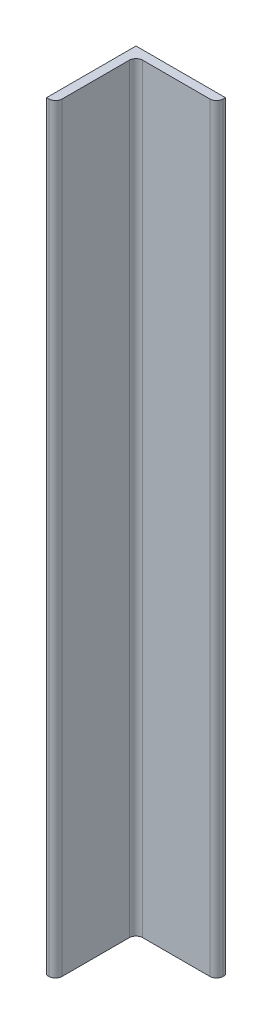
ISO-10303-21;
HEADER;
FILE_DESCRIPTION(('STEP AP214'),'2;1');
FILE_NAME('part.step','',(''),(''),'','','');
FILE_SCHEMA(('AUTOMOTIVE_DESIGN { 1 0 10303 214 1 1 1 1 }'));
ENDSEC;
DATA;
#1=APPLICATION_CONTEXT('core data for automotive mechanical design processes');
#2=APPLICATION_PROTOCOL_DEFINITION('international standard','automotive_design',2000,#1);
#3=PRODUCT_CONTEXT('',#1,'mechanical');
#4=PRODUCT('Part','Part','',(#3));
#5=PRODUCT_RELATED_PRODUCT_CATEGORY('part','',(#4));
#6=PRODUCT_DEFINITION_FORMATION('','',#4);
#7=PRODUCT_DEFINITION_CONTEXT('part definition',#1,'design');
#8=PRODUCT_DEFINITION('design','',#6,#7);
#9=PRODUCT_DEFINITION_SHAPE('','',#8);
#10=(LENGTH_UNIT() NAMED_UNIT(*) SI_UNIT(.MILLI.,.METRE.));
#11=(NAMED_UNIT(*) PLANE_ANGLE_UNIT() SI_UNIT($,.RADIAN.));
#12=(NAMED_UNIT(*) SI_UNIT($,.STERADIAN.) SOLID_ANGLE_UNIT());
#13=UNCERTAINTY_MEASURE_WITH_UNIT(LENGTH_MEASURE(1.E-05),#10,'distance_accuracy_value','');
#14=(GEOMETRIC_REPRESENTATION_CONTEXT(3) GLOBAL_UNCERTAINTY_ASSIGNED_CONTEXT((#13)) GLOBAL_UNIT_ASSIGNED_CONTEXT((#10,
#11,#12)) REPRESENTATION_CONTEXT('',''));
#15=CARTESIAN_POINT('',(0.,0.,0.));
#16=DIRECTION('',(0.,0.,1.));
#17=DIRECTION('',(1.,0.,0.));
#18=AXIS2_PLACEMENT_3D('',#15,#16,#17);
#19=CARTESIAN_POINT('',(-27.4998721449511,340.,-28.213153277017));
#20=DIRECTION('',(-1.,0.,0.));
#21=DIRECTION('',(0.,0.,1.));
#22=AXIS2_PLACEMENT_3D('',#19,#20,#21);
#23=PLANE('',#22);
#24=DIRECTION('',(0.,0.,-1.));
#25=VECTOR('',#24,1.);
#26=CARTESIAN_POINT('',(-27.4998721449561,0.,-28.2131532770167));
#27=LINE('',#26,#25);
#28=CARTESIAN_POINT('',(-27.4998721449561,0.,-28.2131532770167));
#29=VERTEX_POINT('',#28);
#30=CARTESIAN_POINT('',(-27.4998721449561,0.,-29.2131532770167));
#31=VERTEX_POINT('',#30);
#32=EDGE_CURVE('E144',#29,#31,#27,.T.);
#33=ORIENTED_EDGE('',*,*,#32,.T.);
#34=DIRECTION('',(0.,-1.,0.));
#35=VECTOR('',#34,1.);
#36=CARTESIAN_POINT('',(-27.4998721449511,340.,-29.213153277017));
#37=LINE('',#36,#35);
#38=CARTESIAN_POINT('',(-27.4998721449511,340.,-29.213153277017));
#39=VERTEX_POINT('',#38);
#40=EDGE_CURVE('E13',#39,#31,#37,.T.);
#41=ORIENTED_EDGE('',*,*,#40,.F.);
#42=DIRECTION('',(0.,0.,-1.));
#43=VECTOR('',#42,1.);
#44=CARTESIAN_POINT('',(-27.4998721449511,340.,-28.213153277017));
#45=LINE('',#44,#43);
#46=CARTESIAN_POINT('',(-27.4998721449511,340.,-28.213153277017));
#47=VERTEX_POINT('',#46);
#48=EDGE_CURVE('E160',#47,#39,#45,.T.);
#49=ORIENTED_EDGE('',*,*,#48,.F.);
#50=DIRECTION('',(0.,-1.,0.));
#51=VECTOR('',#50,1.);
#52=CARTESIAN_POINT('',(-27.4998721449511,340.,-28.213153277017));
#53=LINE('',#52,#51);
#54=EDGE_CURVE('E140',#47,#29,#53,.T.);
#55=ORIENTED_EDGE('',*,*,#54,.T.);
#56=EDGE_LOOP('',(#33,#41,#49,#55));
#57=FACE_BOUND('',#56,.T.);
#58=ADVANCED_FACE('F42',(#57),#23,.F.);
#59=CARTESIAN_POINT('',(-27.4998721449511,340.,-29.213153277017));
#60=DIRECTION('',(0.,0.,1.));
#61=DIRECTION('',(1.,0.,0.));
#62=AXIS2_PLACEMENT_3D('',#59,#60,#61);
#63=PLANE('',#62);
#64=DIRECTION('',(-1.,0.,0.));
#65=VECTOR('',#64,1.);
#66=CARTESIAN_POINT('',(-27.4998721449561,0.,-29.2131532770167));
#67=LINE('',#66,#65);
#68=CARTESIAN_POINT('',(-67.4998721449561,-9.99200722162641E-13,-29.213153277017));
#69=VERTEX_POINT('',#68);
#70=EDGE_CURVE('E147',#31,#69,#67,.T.);
#71=ORIENTED_EDGE('',*,*,#70,.T.);
#72=DIRECTION('',(0.,-1.,0.));
#73=VECTOR('',#72,1.);
#74=CARTESIAN_POINT('',(-67.4998721449509,339.999999999999,-29.213153277017));
#75=LINE('',#74,#73);
#76=CARTESIAN_POINT('',(-67.4998721449509,339.999999999999,-29.213153277017));
#77=VERTEX_POINT('',#76);
#78=EDGE_CURVE('E50',#77,#69,#75,.T.);
#79=ORIENTED_EDGE('',*,*,#78,.F.);
#80=DIRECTION('',(-1.,0.,0.));
#81=VECTOR('',#80,1.);
#82=CARTESIAN_POINT('',(-27.4998721449511,340.,-29.213153277017));
#83=LINE('',#82,#81);
#84=EDGE_CURVE('E104',#39,#77,#83,.T.);
#85=ORIENTED_EDGE('',*,*,#84,.F.);
#86=ORIENTED_EDGE('',*,*,#40,.T.);
#87=EDGE_LOOP('',(#71,#79,#85,#86));
#88=FACE_BOUND('',#87,.T.);
#89=ADVANCED_FACE('F203',(#88),#63,.F.);
#90=CARTESIAN_POINT('',(-67.4998721449509,339.999999999999,-29.213153277017));
#91=DIRECTION('',(1.,0.,0.));
#92=DIRECTION('',(0.,0.,-1.));
#93=AXIS2_PLACEMENT_3D('',#90,#91,#92);
#94=PLANE('',#93);
#95=DIRECTION('',(0.,0.,1.));
#96=VECTOR('',#95,1.);
#97=CARTESIAN_POINT('',(-67.4998721449561,-9.99200722162641E-13,-29.213153277017));
#98=LINE('',#97,#96);
#99=CARTESIAN_POINT('',(-67.4998721449561,-9.99200722162641E-13,10.786846722983));
#100=VERTEX_POINT('',#99);
#101=EDGE_CURVE('E149',#69,#100,#98,.T.);
#102=ORIENTED_EDGE('',*,*,#101,.T.);
#103=DIRECTION('',(0.,-1.,0.));
#104=VECTOR('',#103,1.);
#105=CARTESIAN_POINT('',(-67.4998721449509,339.999999999999,10.786846722983));
#106=LINE('',#105,#104);
#107=CARTESIAN_POINT('',(-67.4998721449509,339.999999999999,10.786846722983));
#108=VERTEX_POINT('',#107);
#109=EDGE_CURVE('E170',#108,#100,#106,.T.);
#110=ORIENTED_EDGE('',*,*,#109,.F.);
#111=DIRECTION('',(0.,0.,1.));
#112=VECTOR('',#111,1.);
#113=CARTESIAN_POINT('',(-67.4998721449509,339.999999999999,-29.213153277017));
#114=LINE('',#113,#112);
#115=EDGE_CURVE('E178',#77,#108,#114,.T.);
#116=ORIENTED_EDGE('',*,*,#115,.F.);
#117=ORIENTED_EDGE('',*,*,#78,.T.);
#118=EDGE_LOOP('',(#102,#110,#116,#117));
#119=FACE_BOUND('',#118,.T.);
#120=ADVANCED_FACE('F176',(#119),#94,.F.);
#121=CARTESIAN_POINT('',(-67.4998721449509,339.999999999999,10.786846722983));
#122=DIRECTION('',(0.,0.,-1.));
#123=DIRECTION('',(-1.,0.,0.));
#124=AXIS2_PLACEMENT_3D('',#121,#122,#123);
#125=PLANE('',#124);
#126=DIRECTION('',(1.,0.,0.));
#127=VECTOR('',#126,1.);
#128=CARTESIAN_POINT('',(-67.4998721449561,-9.99200722162641E-13,10.786846722983));
#129=LINE('',#128,#127);
#130=CARTESIAN_POINT('',(-66.4998721449561,-9.99200722162641E-13,10.786846722983));
#131=VERTEX_POINT('',#130);
#132=EDGE_CURVE('E151',#100,#131,#129,.T.);
#133=ORIENTED_EDGE('',*,*,#132,.T.);
#134=DIRECTION('',(0.,-1.,0.));
#135=VECTOR('',#134,1.);
#136=CARTESIAN_POINT('',(-66.499872144951,339.999999999999,10.786846722983));
#137=LINE('',#136,#135);
#138=CARTESIAN_POINT('',(-66.499872144951,339.999999999999,10.786846722983));
#139=VERTEX_POINT('',#138);
#140=EDGE_CURVE('E167',#139,#131,#137,.T.);
#141=ORIENTED_EDGE('',*,*,#140,.F.);
#142=DIRECTION('',(1.,0.,0.));
#143=VECTOR('',#142,1.);
#144=CARTESIAN_POINT('',(-67.4998721449509,339.999999999999,10.786846722983));
#145=LINE('',#144,#143);
#146=EDGE_CURVE('E194',#108,#139,#145,.T.);
#147=ORIENTED_EDGE('',*,*,#146,.F.);
#148=ORIENTED_EDGE('',*,*,#109,.T.);
#149=EDGE_LOOP('',(#133,#141,#147,#148));
#150=FACE_BOUND('',#149,.T.);
#151=ADVANCED_FACE('F187',(#150),#125,.F.);
#152=CARTESIAN_POINT('',(-66.4998721449509,339.999999999999,7.78684672298302));
#153=DIRECTION('',(0.,-1.,0.));
#154=DIRECTION('',(0.,0.,-1.));
#155=AXIS2_PLACEMENT_3D('',#152,#153,#154);
#156=CYLINDRICAL_SURFACE('',#155,3.);
#157=CARTESIAN_POINT('',(-66.4998721449561,-9.99200722162641E-13,7.78684672298302));
#158=DIRECTION('',(0.,1.,0.));
#159=DIRECTION('',(0.,0.,1.));
#160=AXIS2_PLACEMENT_3D('',#157,#158,#159);
#161=CIRCLE('',#160,3.);
#162=CARTESIAN_POINT('',(-63.4998721449561,-9.99200722162641E-13,7.78684672298302));
#163=VERTEX_POINT('',#162);
#164=EDGE_CURVE('E153',#131,#163,#161,.T.);
#165=ORIENTED_EDGE('',*,*,#164,.T.);
#166=DIRECTION('',(0.,-1.,0.));
#167=VECTOR('',#166,1.);
#168=CARTESIAN_POINT('',(-63.4998721449509,339.999999999999,7.78684672298302));
#169=LINE('',#168,#167);
#170=CARTESIAN_POINT('',(-63.4998721449509,339.999999999999,7.78684672298302));
#171=VERTEX_POINT('',#170);
#172=EDGE_CURVE('E164',#171,#163,#169,.T.);
#173=ORIENTED_EDGE('',*,*,#172,.F.);
#174=CARTESIAN_POINT('',(-66.4998721449509,339.999999999999,7.78684672298302));
#175=DIRECTION('',(0.,1.,0.));
#176=DIRECTION('',(0.,0.,1.));
#177=AXIS2_PLACEMENT_3D('',#174,#175,#176);
#178=CIRCLE('',#177,3.);
#179=EDGE_CURVE('E193',#139,#171,#178,.T.);
#180=ORIENTED_EDGE('',*,*,#179,.F.);
#181=ORIENTED_EDGE('',*,*,#140,.T.);
#182=EDGE_LOOP('',(#165,#173,#180,#181));
#183=FACE_BOUND('',#182,.T.);
#184=ADVANCED_FACE('F191',(#183),#156,.T.);
#185=CARTESIAN_POINT('',(-63.4998721449509,339.999999999999,7.78684672298302));
#186=DIRECTION('',(-1.,0.,0.));
#187=DIRECTION('',(0.,0.,1.));
#188=AXIS2_PLACEMENT_3D('',#185,#186,#187);
#189=PLANE('',#188);
#190=DIRECTION('',(0.,0.,-1.));
#191=VECTOR('',#190,1.);
#192=CARTESIAN_POINT('',(-63.4998721449561,-9.99200722162641E-13,7.78684672298302));
#193=LINE('',#192,#191);
#194=CARTESIAN_POINT('',(-63.4998721449561,-9.99200722162641E-13,-22.213153277017));
#195=VERTEX_POINT('',#194);
#196=EDGE_CURVE('E155',#163,#195,#193,.T.);
#197=ORIENTED_EDGE('',*,*,#196,.T.);
#198=DIRECTION('',(0.,-1.,0.));
#199=VECTOR('',#198,1.);
#200=CARTESIAN_POINT('',(-63.4998721449509,339.999999999999,-22.213153277017));
#201=LINE('',#200,#199);
#202=CARTESIAN_POINT('',(-63.4998721449509,339.999999999999,-22.213153277017));
#203=VERTEX_POINT('',#202);
#204=EDGE_CURVE('E135',#203,#195,#201,.T.);
#205=ORIENTED_EDGE('',*,*,#204,.F.);
#206=DIRECTION('',(0.,0.,-1.));
#207=VECTOR('',#206,1.);
#208=CARTESIAN_POINT('',(-63.4998721449509,339.999999999999,7.78684672298302));
#209=LINE('',#208,#207);
#210=EDGE_CURVE('E126',#171,#203,#209,.T.);
#211=ORIENTED_EDGE('',*,*,#210,.F.);
#212=ORIENTED_EDGE('',*,*,#172,.T.);
#213=EDGE_LOOP('',(#197,#205,#211,#212));
#214=FACE_BOUND('',#213,.T.);
#215=ADVANCED_FACE('F215',(#214),#189,.F.);
#216=CARTESIAN_POINT('',(-60.499872144951,339.999999999999,-22.213153277017));
#217=DIRECTION('',(0.,-1.,0.));
#218=DIRECTION('',(0.,0.,-1.));
#219=AXIS2_PLACEMENT_3D('',#216,#217,#218);
#220=CYLINDRICAL_SURFACE('',#219,3.);
#221=CARTESIAN_POINT('',(-60.4998721449561,-9.99200722162641E-13,-22.213153277017));
#222=DIRECTION('',(0.,-1.,0.));
#223=DIRECTION('',(0.,0.,-1.));
#224=AXIS2_PLACEMENT_3D('',#221,#222,#223);
#225=CIRCLE('',#224,3.);
#226=CARTESIAN_POINT('',(-60.4998721449561,-9.99200722162641E-13,-25.213153277017));
#227=VERTEX_POINT('',#226);
#228=EDGE_CURVE('E134',#195,#227,#225,.T.);
#229=ORIENTED_EDGE('',*,*,#228,.T.);
#230=DIRECTION('',(0.,-1.,0.));
#231=VECTOR('',#230,1.);
#232=CARTESIAN_POINT('',(-60.499872144951,339.999999999999,-25.213153277017));
#233=LINE('',#232,#231);
#234=CARTESIAN_POINT('',(-60.499872144951,339.999999999999,-25.213153277017));
#235=VERTEX_POINT('',#234);
#236=EDGE_CURVE('E131',#235,#227,#233,.T.);
#237=ORIENTED_EDGE('',*,*,#236,.F.);
#238=CARTESIAN_POINT('',(-60.499872144951,339.999999999999,-22.213153277017));
#239=DIRECTION('',(0.,-1.,0.));
#240=DIRECTION('',(0.,0.,-1.));
#241=AXIS2_PLACEMENT_3D('',#238,#239,#240);
#242=CIRCLE('',#241,3.);
#243=EDGE_CURVE('E120',#203,#235,#242,.T.);
#244=ORIENTED_EDGE('',*,*,#243,.F.);
#245=ORIENTED_EDGE('',*,*,#204,.T.);
#246=EDGE_LOOP('',(#229,#237,#244,#245));
#247=FACE_BOUND('',#246,.T.);
#248=ADVANCED_FACE('F132',(#247),#220,.F.);
#249=CARTESIAN_POINT('',(-60.499872144951,339.999999999999,-25.213153277017));
#250=DIRECTION('',(0.,0.,-1.));
#251=DIRECTION('',(-1.,0.,0.));
#252=AXIS2_PLACEMENT_3D('',#249,#250,#251);
#253=PLANE('',#252);
#254=DIRECTION('',(1.,0.,0.));
#255=VECTOR('',#254,1.);
#256=CARTESIAN_POINT('',(-60.4998721449561,-9.99200722162641E-13,-25.213153277017));
#257=LINE('',#256,#255);
#258=CARTESIAN_POINT('',(-30.4998721449561,0.,-25.2131532770167));
#259=VERTEX_POINT('',#258);
#260=EDGE_CURVE('E90',#227,#259,#257,.T.);
#261=ORIENTED_EDGE('',*,*,#260,.T.);
#262=DIRECTION('',(0.,-1.,0.));
#263=VECTOR('',#262,1.);
#264=CARTESIAN_POINT('',(-30.4998721449511,340.,-25.213153277017));
#265=LINE('',#264,#263);
#266=CARTESIAN_POINT('',(-30.4998721449511,340.,-25.213153277017));
#267=VERTEX_POINT('',#266);
#268=EDGE_CURVE('E136',#267,#259,#265,.T.);
#269=ORIENTED_EDGE('',*,*,#268,.F.);
#270=DIRECTION('',(1.,0.,0.));
#271=VECTOR('',#270,1.);
#272=CARTESIAN_POINT('',(-60.499872144951,339.999999999999,-25.213153277017));
#273=LINE('',#272,#271);
#274=EDGE_CURVE('E124',#235,#267,#273,.T.);
#275=ORIENTED_EDGE('',*,*,#274,.F.);
#276=ORIENTED_EDGE('',*,*,#236,.T.);
#277=EDGE_LOOP('',(#261,#269,#275,#276));
#278=FACE_BOUND('',#277,.T.);
#279=ADVANCED_FACE('F138',(#278),#253,.F.);
#280=CARTESIAN_POINT('',(-30.4998721449511,340.,-28.213153277017));
#281=DIRECTION('',(0.,-1.,0.));
#282=DIRECTION('',(0.,0.,-1.));
#283=AXIS2_PLACEMENT_3D('',#280,#281,#282);
#284=CYLINDRICAL_SURFACE('',#283,3.);
#285=CARTESIAN_POINT('',(-30.4998721449561,0.,-28.2131532770167));
#286=DIRECTION('',(0.,1.,0.));
#287=DIRECTION('',(0.,0.,1.));
#288=AXIS2_PLACEMENT_3D('',#285,#286,#287);
#289=CIRCLE('',#288,3.);
#290=EDGE_CURVE('E96',#259,#29,#289,.T.);
#291=ORIENTED_EDGE('',*,*,#290,.T.);
#292=ORIENTED_EDGE('',*,*,#54,.F.);
#293=CARTESIAN_POINT('',(-30.4998721449511,340.,-28.213153277017));
#294=DIRECTION('',(0.,1.,0.));
#295=DIRECTION('',(0.,0.,1.));
#296=AXIS2_PLACEMENT_3D('',#293,#294,#295);
#297=CIRCLE('',#296,3.);
#298=EDGE_CURVE('E58',#267,#47,#297,.T.);
#299=ORIENTED_EDGE('',*,*,#298,.F.);
#300=ORIENTED_EDGE('',*,*,#268,.T.);
#301=EDGE_LOOP('',(#291,#292,#299,#300));
#302=FACE_BOUND('',#301,.T.);
#303=ADVANCED_FACE('F223',(#302),#284,.T.);
#304=CARTESIAN_POINT('',(-66.4998721449509,339.999999999999,7.78684672298302));
#305=DIRECTION('',(0.,1.,0.));
#306=DIRECTION('',(0.,0.,1.));
#307=AXIS2_PLACEMENT_3D('',#304,#305,#306);
#308=PLANE('',#307);
#309=ORIENTED_EDGE('',*,*,#48,.T.);
#310=ORIENTED_EDGE('',*,*,#84,.T.);
#311=ORIENTED_EDGE('',*,*,#115,.T.);
#312=ORIENTED_EDGE('',*,*,#146,.T.);
#313=ORIENTED_EDGE('',*,*,#179,.T.);
#314=ORIENTED_EDGE('',*,*,#210,.T.);
#315=ORIENTED_EDGE('',*,*,#243,.T.);
#316=ORIENTED_EDGE('',*,*,#274,.T.);
#317=ORIENTED_EDGE('',*,*,#298,.T.);
#318=EDGE_LOOP('',(#309,#310,#311,#312,#313,#314,#315,#316,#317));
#319=FACE_BOUND('',#318,.T.);
#320=ADVANCED_FACE('F122',(#319),#308,.T.);
#321=CARTESIAN_POINT('',(-66.4998721449561,-9.99200722162641E-13,7.78684672298302));
#322=DIRECTION('',(0.,1.,0.));
#323=DIRECTION('',(0.,0.,1.));
#324=AXIS2_PLACEMENT_3D('',#321,#322,#323);
#325=PLANE('',#324);
#326=ORIENTED_EDGE('',*,*,#32,.F.);
#327=ORIENTED_EDGE('',*,*,#290,.F.);
#328=ORIENTED_EDGE('',*,*,#260,.F.);
#329=ORIENTED_EDGE('',*,*,#228,.F.);
#330=ORIENTED_EDGE('',*,*,#196,.F.);
#331=ORIENTED_EDGE('',*,*,#164,.F.);
#332=ORIENTED_EDGE('',*,*,#132,.F.);
#333=ORIENTED_EDGE('',*,*,#101,.F.);
#334=ORIENTED_EDGE('',*,*,#70,.F.);
#335=EDGE_LOOP('',(#326,#327,#328,#329,#330,#331,#332,#333,#334));
#336=FACE_BOUND('',#335,.T.);
#337=ADVANCED_FACE('F182',(#336),#325,.F.);
#338=CLOSED_SHELL('',(#58,#89,#120,#151,#184,#215,#248,#279,#303,#320,#337));
#339=MANIFOLD_SOLID_BREP('B2',#338);
#340=ADVANCED_BREP_SHAPE_REPRESENTATION('',(#18,#339),#14);
#341=SHAPE_DEFINITION_REPRESENTATION(#9,#340);
ENDSEC;
END-ISO-10303-21;
